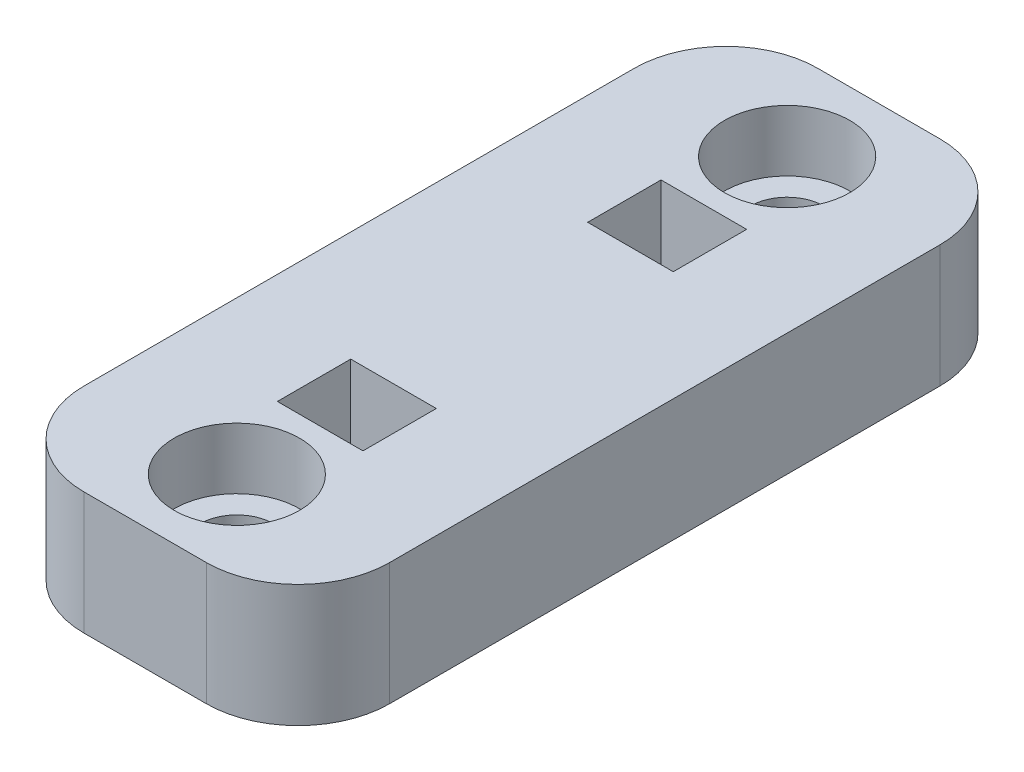
ISO-10303-21;
HEADER;
FILE_DESCRIPTION(('STEP AP214'),'2;1');
FILE_NAME('part.step','',(''),(''),'','','');
FILE_SCHEMA(('AUTOMOTIVE_DESIGN { 1 0 10303 214 1 1 1 1 }'));
ENDSEC;
DATA;
#1=APPLICATION_CONTEXT('core data for automotive mechanical design processes');
#2=APPLICATION_PROTOCOL_DEFINITION('international standard','automotive_design',2000,#1);
#3=PRODUCT_CONTEXT('',#1,'mechanical');
#4=PRODUCT('Part','Part','',(#3));
#5=PRODUCT_RELATED_PRODUCT_CATEGORY('part','',(#4));
#6=PRODUCT_DEFINITION_FORMATION('','',#4);
#7=PRODUCT_DEFINITION_CONTEXT('part definition',#1,'design');
#8=PRODUCT_DEFINITION('design','',#6,#7);
#9=PRODUCT_DEFINITION_SHAPE('','',#8);
#10=(LENGTH_UNIT() NAMED_UNIT(*) SI_UNIT(.MILLI.,.METRE.));
#11=(NAMED_UNIT(*) PLANE_ANGLE_UNIT() SI_UNIT($,.RADIAN.));
#12=(NAMED_UNIT(*) SI_UNIT($,.STERADIAN.) SOLID_ANGLE_UNIT());
#13=UNCERTAINTY_MEASURE_WITH_UNIT(LENGTH_MEASURE(1.E-05),#10,'distance_accuracy_value','');
#14=(GEOMETRIC_REPRESENTATION_CONTEXT(3) GLOBAL_UNCERTAINTY_ASSIGNED_CONTEXT((#13)) GLOBAL_UNIT_ASSIGNED_CONTEXT((#10,
#11,#12)) REPRESENTATION_CONTEXT('',''));
#15=CARTESIAN_POINT('',(0.,0.,0.));
#16=DIRECTION('',(0.,0.,1.));
#17=DIRECTION('',(1.,0.,0.));
#18=AXIS2_PLACEMENT_3D('',#15,#16,#17);
#19=CARTESIAN_POINT('',(5.,4.,-21.));
#20=DIRECTION('',(0.,-1.,0.));
#21=DIRECTION('',(0.,0.,-1.));
#22=AXIS2_PLACEMENT_3D('',#19,#20,#21);
#23=CYLINDRICAL_SURFACE('',#22,1.2);
#24=CARTESIAN_POINT('',(5.,0.,-21.));
#25=DIRECTION('',(0.,1.,0.));
#26=DIRECTION('',(0.,0.,1.));
#27=AXIS2_PLACEMENT_3D('',#24,#25,#26);
#28=CIRCLE('',#27,1.2);
#29=CARTESIAN_POINT('',(5.,0.,-19.8));
#30=VERTEX_POINT('',#29);
#31=EDGE_CURVE('E200',#30,#30,#28,.T.);
#32=ORIENTED_EDGE('',*,*,#31,.F.);
#33=EDGE_LOOP('',(#32));
#34=FACE_BOUND('',#33,.T.);
#35=CARTESIAN_POINT('',(5.,2.,-21.));
#36=DIRECTION('',(0.,1.,0.));
#37=DIRECTION('',(0.,0.,1.));
#38=AXIS2_PLACEMENT_3D('',#35,#36,#37);
#39=CIRCLE('',#38,1.2);
#40=CARTESIAN_POINT('',(5.,2.,-19.8));
#41=VERTEX_POINT('',#40);
#42=EDGE_CURVE('E47',#41,#41,#39,.T.);
#43=ORIENTED_EDGE('',*,*,#42,.T.);
#44=EDGE_LOOP('',(#43));
#45=FACE_BOUND('',#44,.T.);
#46=ADVANCED_FACE('F43',(#34,#45),#23,.F.);
#47=CARTESIAN_POINT('',(5.,4.,-3.));
#48=DIRECTION('',(0.,-1.,0.));
#49=DIRECTION('',(0.,0.,-1.));
#50=AXIS2_PLACEMENT_3D('',#47,#48,#49);
#51=CYLINDRICAL_SURFACE('',#50,1.2);
#52=CARTESIAN_POINT('',(5.,0.,-3.));
#53=DIRECTION('',(0.,1.,0.));
#54=DIRECTION('',(0.,0.,1.));
#55=AXIS2_PLACEMENT_3D('',#52,#53,#54);
#56=CIRCLE('',#55,1.2);
#57=CARTESIAN_POINT('',(5.,0.,-1.8));
#58=VERTEX_POINT('',#57);
#59=EDGE_CURVE('E342',#58,#58,#56,.T.);
#60=ORIENTED_EDGE('',*,*,#59,.F.);
#61=EDGE_LOOP('',(#60));
#62=FACE_BOUND('',#61,.T.);
#63=CARTESIAN_POINT('',(5.,2.,-3.));
#64=DIRECTION('',(0.,1.,0.));
#65=DIRECTION('',(0.,0.,1.));
#66=AXIS2_PLACEMENT_3D('',#63,#64,#65);
#67=CIRCLE('',#66,1.2);
#68=CARTESIAN_POINT('',(5.,2.,-1.8));
#69=VERTEX_POINT('',#68);
#70=EDGE_CURVE('E333',#69,#69,#67,.T.);
#71=ORIENTED_EDGE('',*,*,#70,.T.);
#72=EDGE_LOOP('',(#71));
#73=FACE_BOUND('',#72,.T.);
#74=ADVANCED_FACE('F371',(#62,#73),#51,.F.);
#75=CARTESIAN_POINT('',(0.,4.,0.));
#76=DIRECTION('',(0.,-1.,0.));
#77=DIRECTION('',(0.,0.,-1.));
#78=AXIS2_PLACEMENT_3D('',#75,#76,#77);
#79=PLANE('',#78);
#80=CARTESIAN_POINT('',(5.,4.,-3.));
#81=DIRECTION('',(0.,1.,0.));
#82=DIRECTION('',(0.,0.,1.));
#83=AXIS2_PLACEMENT_3D('',#80,#81,#82);
#84=CIRCLE('',#83,2.05);
#85=CARTESIAN_POINT('',(5.,4.,-0.950000000000001));
#86=VERTEX_POINT('',#85);
#87=EDGE_CURVE('E344',#86,#86,#84,.T.);
#88=ORIENTED_EDGE('',*,*,#87,.F.);
#89=EDGE_LOOP('',(#88));
#90=FACE_BOUND('',#89,.T.);
#91=CARTESIAN_POINT('',(5.,4.,-21.));
#92=DIRECTION('',(0.,1.,0.));
#93=DIRECTION('',(0.,0.,1.));
#94=AXIS2_PLACEMENT_3D('',#91,#92,#93);
#95=CIRCLE('',#94,2.05);
#96=CARTESIAN_POINT('',(5.,4.,-18.95));
#97=VERTEX_POINT('',#96);
#98=EDGE_CURVE('E350',#97,#97,#95,.T.);
#99=ORIENTED_EDGE('',*,*,#98,.F.);
#100=EDGE_LOOP('',(#99));
#101=FACE_BOUND('',#100,.T.);
#102=DIRECTION('',(0.,0.,1.));
#103=VECTOR('',#102,1.);
#104=CARTESIAN_POINT('',(3.6,4.,-18.275));
#105=LINE('',#104,#103);
#106=CARTESIAN_POINT('',(3.6,4.,-18.275));
#107=VERTEX_POINT('',#106);
#108=CARTESIAN_POINT('',(3.6,4.,-15.875));
#109=VERTEX_POINT('',#108);
#110=EDGE_CURVE('E217',#107,#109,#105,.T.);
#111=ORIENTED_EDGE('',*,*,#110,.F.);
#112=DIRECTION('',(-1.,0.,0.));
#113=VECTOR('',#112,1.);
#114=CARTESIAN_POINT('',(3.6,4.,-18.275));
#115=LINE('',#114,#113);
#116=CARTESIAN_POINT('',(6.4,4.,-18.275));
#117=VERTEX_POINT('',#116);
#118=EDGE_CURVE('E228',#117,#107,#115,.T.);
#119=ORIENTED_EDGE('',*,*,#118,.F.);
#120=DIRECTION('',(0.,0.,-1.));
#121=VECTOR('',#120,1.);
#122=CARTESIAN_POINT('',(6.4,4.,-18.275));
#123=LINE('',#122,#121);
#124=CARTESIAN_POINT('',(6.4,4.,-15.875));
#125=VERTEX_POINT('',#124);
#126=EDGE_CURVE('E224',#125,#117,#123,.T.);
#127=ORIENTED_EDGE('',*,*,#126,.F.);
#128=DIRECTION('',(1.,0.,0.));
#129=VECTOR('',#128,1.);
#130=CARTESIAN_POINT('',(3.6,4.,-15.875));
#131=LINE('',#130,#129);
#132=EDGE_CURVE('E220',#109,#125,#131,.T.);
#133=ORIENTED_EDGE('',*,*,#132,.F.);
#134=EDGE_LOOP('',(#111,#119,#127,#133));
#135=FACE_BOUND('',#134,.T.);
#136=DIRECTION('',(-1.,0.,0.));
#137=VECTOR('',#136,1.);
#138=CARTESIAN_POINT('',(0.,4.,-24.));
#139=LINE('',#138,#137);
#140=CARTESIAN_POINT('',(7.,4.,-24.));
#141=VERTEX_POINT('',#140);
#142=CARTESIAN_POINT('',(3.,4.,-24.));
#143=VERTEX_POINT('',#142);
#144=EDGE_CURVE('E271',#141,#143,#139,.T.);
#145=ORIENTED_EDGE('',*,*,#144,.T.);
#146=CARTESIAN_POINT('',(3.,4.,-21.));
#147=DIRECTION('',(0.,-1.,0.));
#148=DIRECTION('',(0.,0.,-1.));
#149=AXIS2_PLACEMENT_3D('',#146,#147,#148);
#150=CIRCLE('',#149,3.);
#151=CARTESIAN_POINT('',(0.,4.,-21.));
#152=VERTEX_POINT('',#151);
#153=EDGE_CURVE('E322',#143,#152,#150,.F.);
#154=ORIENTED_EDGE('',*,*,#153,.T.);
#155=DIRECTION('',(0.,0.,1.));
#156=VECTOR('',#155,1.);
#157=CARTESIAN_POINT('',(0.,4.,0.));
#158=LINE('',#157,#156);
#159=CARTESIAN_POINT('',(0.,4.,-3.));
#160=VERTEX_POINT('',#159);
#161=EDGE_CURVE('E260',#152,#160,#158,.T.);
#162=ORIENTED_EDGE('',*,*,#161,.T.);
#163=CARTESIAN_POINT('',(3.,4.,-3.));
#164=DIRECTION('',(0.,-1.,0.));
#165=DIRECTION('',(0.,0.,-1.));
#166=AXIS2_PLACEMENT_3D('',#163,#164,#165);
#167=CIRCLE('',#166,3.);
#168=CARTESIAN_POINT('',(3.,4.,0.));
#169=VERTEX_POINT('',#168);
#170=EDGE_CURVE('E314',#160,#169,#167,.F.);
#171=ORIENTED_EDGE('',*,*,#170,.T.);
#172=DIRECTION('',(1.,0.,0.));
#173=VECTOR('',#172,1.);
#174=CARTESIAN_POINT('',(0.,4.,0.));
#175=LINE('',#174,#173);
#176=CARTESIAN_POINT('',(7.,4.,0.));
#177=VERTEX_POINT('',#176);
#178=EDGE_CURVE('E264',#169,#177,#175,.T.);
#179=ORIENTED_EDGE('',*,*,#178,.T.);
#180=CARTESIAN_POINT('',(7.,4.,-3.));
#181=DIRECTION('',(0.,-1.,0.));
#182=DIRECTION('',(0.,0.,-1.));
#183=AXIS2_PLACEMENT_3D('',#180,#181,#182);
#184=CIRCLE('',#183,3.);
#185=CARTESIAN_POINT('',(10.,4.,-3.));
#186=VERTEX_POINT('',#185);
#187=EDGE_CURVE('E68',#177,#186,#184,.F.);
#188=ORIENTED_EDGE('',*,*,#187,.T.);
#189=DIRECTION('',(0.,0.,-1.));
#190=VECTOR('',#189,1.);
#191=CARTESIAN_POINT('',(10.,4.,0.));
#192=LINE('',#191,#190);
#193=CARTESIAN_POINT('',(10.,4.,-21.));
#194=VERTEX_POINT('',#193);
#195=EDGE_CURVE('E268',#186,#194,#192,.T.);
#196=ORIENTED_EDGE('',*,*,#195,.T.);
#197=CARTESIAN_POINT('',(7.,4.,-21.));
#198=DIRECTION('',(0.,-1.,0.));
#199=DIRECTION('',(0.,0.,-1.));
#200=AXIS2_PLACEMENT_3D('',#197,#198,#199);
#201=CIRCLE('',#200,3.);
#202=EDGE_CURVE('E319',#194,#141,#201,.F.);
#203=ORIENTED_EDGE('',*,*,#202,.T.);
#204=EDGE_LOOP('',(#145,#154,#162,#171,#179,#188,#196,#203));
#205=FACE_BOUND('',#204,.T.);
#206=DIRECTION('',(0.,0.,1.));
#207=VECTOR('',#206,1.);
#208=CARTESIAN_POINT('',(3.6,4.,-8.125));
#209=LINE('',#208,#207);
#210=CARTESIAN_POINT('',(3.6,4.,-8.125));
#211=VERTEX_POINT('',#210);
#212=CARTESIAN_POINT('',(3.6,4.,-5.725));
#213=VERTEX_POINT('',#212);
#214=EDGE_CURVE('E161',#211,#213,#209,.T.);
#215=ORIENTED_EDGE('',*,*,#214,.F.);
#216=DIRECTION('',(-1.,0.,0.));
#217=VECTOR('',#216,1.);
#218=CARTESIAN_POINT('',(3.6,4.,-8.125));
#219=LINE('',#218,#217);
#220=CARTESIAN_POINT('',(6.4,4.,-8.125));
#221=VERTEX_POINT('',#220);
#222=EDGE_CURVE('E191',#221,#211,#219,.T.);
#223=ORIENTED_EDGE('',*,*,#222,.F.);
#224=DIRECTION('',(0.,0.,-1.));
#225=VECTOR('',#224,1.);
#226=CARTESIAN_POINT('',(6.4,4.,-8.125));
#227=LINE('',#226,#225);
#228=CARTESIAN_POINT('',(6.4,4.,-5.725));
#229=VERTEX_POINT('',#228);
#230=EDGE_CURVE('E187',#229,#221,#227,.T.);
#231=ORIENTED_EDGE('',*,*,#230,.F.);
#232=DIRECTION('',(1.,0.,0.));
#233=VECTOR('',#232,1.);
#234=CARTESIAN_POINT('',(3.6,4.,-5.725));
#235=LINE('',#234,#233);
#236=EDGE_CURVE('E172',#213,#229,#235,.T.);
#237=ORIENTED_EDGE('',*,*,#236,.F.);
#238=EDGE_LOOP('',(#215,#223,#231,#237));
#239=FACE_BOUND('',#238,.T.);
#240=ADVANCED_FACE('F185',(#90,#101,#135,#205,#239),#79,.F.);
#241=CARTESIAN_POINT('',(0.,0.,0.));
#242=DIRECTION('',(0.,-1.,0.));
#243=DIRECTION('',(0.,0.,-1.));
#244=AXIS2_PLACEMENT_3D('',#241,#242,#243);
#245=PLANE('',#244);
#246=ORIENTED_EDGE('',*,*,#31,.T.);
#247=EDGE_LOOP('',(#246));
#248=FACE_BOUND('',#247,.T.);
#249=DIRECTION('',(0.,0.,1.));
#250=VECTOR('',#249,1.);
#251=CARTESIAN_POINT('',(0.,0.,0.));
#252=LINE('',#251,#250);
#253=CARTESIAN_POINT('',(0.,0.,-21.));
#254=VERTEX_POINT('',#253);
#255=CARTESIAN_POINT('',(0.,0.,-3.));
#256=VERTEX_POINT('',#255);
#257=EDGE_CURVE('E259',#254,#256,#252,.T.);
#258=ORIENTED_EDGE('',*,*,#257,.F.);
#259=CARTESIAN_POINT('',(3.,0.,-21.));
#260=DIRECTION('',(0.,-1.,0.));
#261=DIRECTION('',(0.,0.,-1.));
#262=AXIS2_PLACEMENT_3D('',#259,#260,#261);
#263=CIRCLE('',#262,3.);
#264=CARTESIAN_POINT('',(3.,0.,-24.));
#265=VERTEX_POINT('',#264);
#266=EDGE_CURVE('E304',#254,#265,#263,.T.);
#267=ORIENTED_EDGE('',*,*,#266,.T.);
#268=DIRECTION('',(-1.,0.,0.));
#269=VECTOR('',#268,1.);
#270=CARTESIAN_POINT('',(0.,0.,-24.));
#271=LINE('',#270,#269);
#272=CARTESIAN_POINT('',(7.,0.,-24.));
#273=VERTEX_POINT('',#272);
#274=EDGE_CURVE('E265',#273,#265,#271,.T.);
#275=ORIENTED_EDGE('',*,*,#274,.F.);
#276=CARTESIAN_POINT('',(7.,0.,-21.));
#277=DIRECTION('',(0.,-1.,0.));
#278=DIRECTION('',(0.,0.,-1.));
#279=AXIS2_PLACEMENT_3D('',#276,#277,#278);
#280=CIRCLE('',#279,3.);
#281=CARTESIAN_POINT('',(10.,0.,-21.));
#282=VERTEX_POINT('',#281);
#283=EDGE_CURVE('E301',#273,#282,#280,.T.);
#284=ORIENTED_EDGE('',*,*,#283,.T.);
#285=DIRECTION('',(0.,0.,-1.));
#286=VECTOR('',#285,1.);
#287=CARTESIAN_POINT('',(10.,0.,0.));
#288=LINE('',#287,#286);
#289=CARTESIAN_POINT('',(10.,0.,-3.));
#290=VERTEX_POINT('',#289);
#291=EDGE_CURVE('E283',#290,#282,#288,.T.);
#292=ORIENTED_EDGE('',*,*,#291,.F.);
#293=CARTESIAN_POINT('',(7.,0.,-3.));
#294=DIRECTION('',(0.,-1.,0.));
#295=DIRECTION('',(0.,0.,-1.));
#296=AXIS2_PLACEMENT_3D('',#293,#294,#295);
#297=CIRCLE('',#296,3.);
#298=CARTESIAN_POINT('',(7.,0.,0.));
#299=VERTEX_POINT('',#298);
#300=EDGE_CURVE('E298',#290,#299,#297,.T.);
#301=ORIENTED_EDGE('',*,*,#300,.T.);
#302=DIRECTION('',(1.,0.,0.));
#303=VECTOR('',#302,1.);
#304=CARTESIAN_POINT('',(0.,0.,0.));
#305=LINE('',#304,#303);
#306=CARTESIAN_POINT('',(3.,0.,0.));
#307=VERTEX_POINT('',#306);
#308=EDGE_CURVE('E279',#307,#299,#305,.T.);
#309=ORIENTED_EDGE('',*,*,#308,.F.);
#310=CARTESIAN_POINT('',(3.,0.,-3.));
#311=DIRECTION('',(0.,-1.,0.));
#312=DIRECTION('',(0.,0.,-1.));
#313=AXIS2_PLACEMENT_3D('',#310,#311,#312);
#314=CIRCLE('',#313,3.);
#315=EDGE_CURVE('E295',#307,#256,#314,.T.);
#316=ORIENTED_EDGE('',*,*,#315,.T.);
#317=EDGE_LOOP('',(#258,#267,#275,#284,#292,#301,#309,#316));
#318=FACE_BOUND('',#317,.T.);
#319=DIRECTION('',(-1.,0.,0.));
#320=VECTOR('',#319,1.);
#321=CARTESIAN_POINT('',(3.6,0.,-18.275));
#322=LINE('',#321,#320);
#323=CARTESIAN_POINT('',(6.4,0.,-18.275));
#324=VERTEX_POINT('',#323);
#325=CARTESIAN_POINT('',(3.6,0.,-18.275));
#326=VERTEX_POINT('',#325);
#327=EDGE_CURVE('E221',#324,#326,#322,.T.);
#328=ORIENTED_EDGE('',*,*,#327,.T.);
#329=DIRECTION('',(0.,0.,1.));
#330=VECTOR('',#329,1.);
#331=CARTESIAN_POINT('',(3.6,0.,-18.275));
#332=LINE('',#331,#330);
#333=CARTESIAN_POINT('',(3.6,0.,-15.875));
#334=VERTEX_POINT('',#333);
#335=EDGE_CURVE('E181',#326,#334,#332,.T.);
#336=ORIENTED_EDGE('',*,*,#335,.T.);
#337=DIRECTION('',(1.,0.,0.));
#338=VECTOR('',#337,1.);
#339=CARTESIAN_POINT('',(3.6,0.,-15.875));
#340=LINE('',#339,#338);
#341=CARTESIAN_POINT('',(6.4,0.,-15.875));
#342=VERTEX_POINT('',#341);
#343=EDGE_CURVE('E235',#334,#342,#340,.T.);
#344=ORIENTED_EDGE('',*,*,#343,.T.);
#345=DIRECTION('',(0.,0.,-1.));
#346=VECTOR('',#345,1.);
#347=CARTESIAN_POINT('',(6.4,0.,-18.275));
#348=LINE('',#347,#346);
#349=EDGE_CURVE('E239',#342,#324,#348,.T.);
#350=ORIENTED_EDGE('',*,*,#349,.T.);
#351=EDGE_LOOP('',(#328,#336,#344,#350));
#352=FACE_BOUND('',#351,.T.);
#353=DIRECTION('',(-1.,0.,0.));
#354=VECTOR('',#353,1.);
#355=CARTESIAN_POINT('',(3.6,0.,-8.125));
#356=LINE('',#355,#354);
#357=CARTESIAN_POINT('',(6.4,0.,-8.125));
#358=VERTEX_POINT('',#357);
#359=CARTESIAN_POINT('',(3.6,0.,-8.125));
#360=VERTEX_POINT('',#359);
#361=EDGE_CURVE('E173',#358,#360,#356,.T.);
#362=ORIENTED_EDGE('',*,*,#361,.T.);
#363=DIRECTION('',(0.,0.,1.));
#364=VECTOR('',#363,1.);
#365=CARTESIAN_POINT('',(3.6,0.,-8.125));
#366=LINE('',#365,#364);
#367=CARTESIAN_POINT('',(3.6,0.,-5.725));
#368=VERTEX_POINT('',#367);
#369=EDGE_CURVE('E197',#360,#368,#366,.T.);
#370=ORIENTED_EDGE('',*,*,#369,.T.);
#371=DIRECTION('',(1.,0.,0.));
#372=VECTOR('',#371,1.);
#373=CARTESIAN_POINT('',(3.6,0.,-5.725));
#374=LINE('',#373,#372);
#375=CARTESIAN_POINT('',(6.4,0.,-5.725));
#376=VERTEX_POINT('',#375);
#377=EDGE_CURVE('E179',#368,#376,#374,.T.);
#378=ORIENTED_EDGE('',*,*,#377,.T.);
#379=DIRECTION('',(0.,0.,-1.));
#380=VECTOR('',#379,1.);
#381=CARTESIAN_POINT('',(6.4,0.,-8.125));
#382=LINE('',#381,#380);
#383=EDGE_CURVE('E203',#376,#358,#382,.T.);
#384=ORIENTED_EDGE('',*,*,#383,.T.);
#385=EDGE_LOOP('',(#362,#370,#378,#384));
#386=FACE_BOUND('',#385,.T.);
#387=ORIENTED_EDGE('',*,*,#59,.T.);
#388=EDGE_LOOP('',(#387));
#389=FACE_BOUND('',#388,.T.);
#390=ADVANCED_FACE('F366',(#248,#318,#352,#386,#389),#245,.T.);
#391=CARTESIAN_POINT('',(0.,4.,0.));
#392=DIRECTION('',(1.,0.,0.));
#393=DIRECTION('',(0.,0.,-1.));
#394=AXIS2_PLACEMENT_3D('',#391,#392,#393);
#395=PLANE('',#394);
#396=ORIENTED_EDGE('',*,*,#161,.F.);
#397=DIRECTION('',(0.,-1.,0.));
#398=VECTOR('',#397,1.);
#399=CARTESIAN_POINT('',(0.,4.,-21.));
#400=LINE('',#399,#398);
#401=EDGE_CURVE('E291',#152,#254,#400,.T.);
#402=ORIENTED_EDGE('',*,*,#401,.T.);
#403=ORIENTED_EDGE('',*,*,#257,.T.);
#404=DIRECTION('',(0.,-1.,0.));
#405=VECTOR('',#404,1.);
#406=CARTESIAN_POINT('',(0.,4.,-3.));
#407=LINE('',#406,#405);
#408=EDGE_CURVE('E275',#256,#160,#407,.F.);
#409=ORIENTED_EDGE('',*,*,#408,.T.);
#410=EDGE_LOOP('',(#396,#402,#403,#409));
#411=FACE_BOUND('',#410,.T.);
#412=ADVANCED_FACE('F407',(#411),#395,.F.);
#413=CARTESIAN_POINT('',(0.,4.,0.));
#414=DIRECTION('',(0.,0.,-1.));
#415=DIRECTION('',(-1.,0.,0.));
#416=AXIS2_PLACEMENT_3D('',#413,#414,#415);
#417=PLANE('',#416);
#418=ORIENTED_EDGE('',*,*,#308,.T.);
#419=DIRECTION('',(0.,-1.,0.));
#420=VECTOR('',#419,1.);
#421=CARTESIAN_POINT('',(7.,4.,0.));
#422=LINE('',#421,#420);
#423=EDGE_CURVE('E11',#299,#177,#422,.F.);
#424=ORIENTED_EDGE('',*,*,#423,.T.);
#425=ORIENTED_EDGE('',*,*,#178,.F.);
#426=DIRECTION('',(0.,-1.,0.));
#427=VECTOR('',#426,1.);
#428=CARTESIAN_POINT('',(3.,4.,0.));
#429=LINE('',#428,#427);
#430=EDGE_CURVE('E53',#169,#307,#429,.T.);
#431=ORIENTED_EDGE('',*,*,#430,.T.);
#432=EDGE_LOOP('',(#418,#424,#425,#431));
#433=FACE_BOUND('',#432,.T.);
#434=ADVANCED_FACE('F417',(#433),#417,.F.);
#435=CARTESIAN_POINT('',(10.,4.,0.));
#436=DIRECTION('',(-1.,0.,0.));
#437=DIRECTION('',(0.,0.,1.));
#438=AXIS2_PLACEMENT_3D('',#435,#436,#437);
#439=PLANE('',#438);
#440=ORIENTED_EDGE('',*,*,#291,.T.);
#441=DIRECTION('',(0.,-1.,0.));
#442=VECTOR('',#441,1.);
#443=CARTESIAN_POINT('',(10.,4.,-21.));
#444=LINE('',#443,#442);
#445=EDGE_CURVE('E61',#282,#194,#444,.F.);
#446=ORIENTED_EDGE('',*,*,#445,.T.);
#447=ORIENTED_EDGE('',*,*,#195,.F.);
#448=DIRECTION('',(0.,-1.,0.));
#449=VECTOR('',#448,1.);
#450=CARTESIAN_POINT('',(10.,4.,-3.));
#451=LINE('',#450,#449);
#452=EDGE_CURVE('E325',#186,#290,#451,.T.);
#453=ORIENTED_EDGE('',*,*,#452,.T.);
#454=EDGE_LOOP('',(#440,#446,#447,#453));
#455=FACE_BOUND('',#454,.T.);
#456=ADVANCED_FACE('F423',(#455),#439,.F.);
#457=CARTESIAN_POINT('',(0.,4.,-24.));
#458=DIRECTION('',(0.,0.,1.));
#459=DIRECTION('',(1.,0.,0.));
#460=AXIS2_PLACEMENT_3D('',#457,#458,#459);
#461=PLANE('',#460);
#462=ORIENTED_EDGE('',*,*,#274,.T.);
#463=DIRECTION('',(0.,-1.,0.));
#464=VECTOR('',#463,1.);
#465=CARTESIAN_POINT('',(3.,4.,-24.));
#466=LINE('',#465,#464);
#467=EDGE_CURVE('E311',#265,#143,#466,.F.);
#468=ORIENTED_EDGE('',*,*,#467,.T.);
#469=ORIENTED_EDGE('',*,*,#144,.F.);
#470=DIRECTION('',(0.,-1.,0.));
#471=VECTOR('',#470,1.);
#472=CARTESIAN_POINT('',(7.,4.,-24.));
#473=LINE('',#472,#471);
#474=EDGE_CURVE('E307',#141,#273,#473,.T.);
#475=ORIENTED_EDGE('',*,*,#474,.T.);
#476=EDGE_LOOP('',(#462,#468,#469,#475));
#477=FACE_BOUND('',#476,.T.);
#478=ADVANCED_FACE('F426',(#477),#461,.F.);
#479=CARTESIAN_POINT('',(3.6,4.,-18.275));
#480=DIRECTION('',(1.,0.,0.));
#481=DIRECTION('',(0.,0.,-1.));
#482=AXIS2_PLACEMENT_3D('',#479,#480,#481);
#483=PLANE('',#482);
#484=ORIENTED_EDGE('',*,*,#335,.F.);
#485=DIRECTION('',(0.,-1.,0.));
#486=VECTOR('',#485,1.);
#487=CARTESIAN_POINT('',(3.6,4.,-18.275));
#488=LINE('',#487,#486);
#489=EDGE_CURVE('E231',#107,#326,#488,.T.);
#490=ORIENTED_EDGE('',*,*,#489,.F.);
#491=ORIENTED_EDGE('',*,*,#110,.T.);
#492=DIRECTION('',(0.,-1.,0.));
#493=VECTOR('',#492,1.);
#494=CARTESIAN_POINT('',(3.6,4.,-15.875));
#495=LINE('',#494,#493);
#496=EDGE_CURVE('E255',#109,#334,#495,.T.);
#497=ORIENTED_EDGE('',*,*,#496,.T.);
#498=EDGE_LOOP('',(#484,#490,#491,#497));
#499=FACE_BOUND('',#498,.T.);
#500=ADVANCED_FACE('F428',(#499),#483,.T.);
#501=CARTESIAN_POINT('',(3.6,4.,-15.875));
#502=DIRECTION('',(0.,0.,-1.));
#503=DIRECTION('',(-1.,0.,0.));
#504=AXIS2_PLACEMENT_3D('',#501,#502,#503);
#505=PLANE('',#504);
#506=ORIENTED_EDGE('',*,*,#343,.F.);
#507=ORIENTED_EDGE('',*,*,#496,.F.);
#508=ORIENTED_EDGE('',*,*,#132,.T.);
#509=DIRECTION('',(0.,-1.,0.));
#510=VECTOR('',#509,1.);
#511=CARTESIAN_POINT('',(6.4,4.,-15.875));
#512=LINE('',#511,#510);
#513=EDGE_CURVE('E252',#125,#342,#512,.T.);
#514=ORIENTED_EDGE('',*,*,#513,.T.);
#515=EDGE_LOOP('',(#506,#507,#508,#514));
#516=FACE_BOUND('',#515,.T.);
#517=ADVANCED_FACE('F434',(#516),#505,.T.);
#518=CARTESIAN_POINT('',(6.4,4.,-18.275));
#519=DIRECTION('',(-1.,0.,0.));
#520=DIRECTION('',(0.,0.,1.));
#521=AXIS2_PLACEMENT_3D('',#518,#519,#520);
#522=PLANE('',#521);
#523=ORIENTED_EDGE('',*,*,#349,.F.);
#524=ORIENTED_EDGE('',*,*,#513,.F.);
#525=ORIENTED_EDGE('',*,*,#126,.T.);
#526=DIRECTION('',(0.,-1.,0.));
#527=VECTOR('',#526,1.);
#528=CARTESIAN_POINT('',(6.4,4.,-18.275));
#529=LINE('',#528,#527);
#530=EDGE_CURVE('E249',#117,#324,#529,.T.);
#531=ORIENTED_EDGE('',*,*,#530,.T.);
#532=EDGE_LOOP('',(#523,#524,#525,#531));
#533=FACE_BOUND('',#532,.T.);
#534=ADVANCED_FACE('F482',(#533),#522,.T.);
#535=CARTESIAN_POINT('',(3.6,4.,-18.275));
#536=DIRECTION('',(0.,0.,1.));
#537=DIRECTION('',(1.,0.,0.));
#538=AXIS2_PLACEMENT_3D('',#535,#536,#537);
#539=PLANE('',#538);
#540=ORIENTED_EDGE('',*,*,#327,.F.);
#541=ORIENTED_EDGE('',*,*,#530,.F.);
#542=ORIENTED_EDGE('',*,*,#118,.T.);
#543=ORIENTED_EDGE('',*,*,#489,.T.);
#544=EDGE_LOOP('',(#540,#541,#542,#543));
#545=FACE_BOUND('',#544,.T.);
#546=ADVANCED_FACE('F479',(#545),#539,.T.);
#547=CARTESIAN_POINT('',(3.6,4.,-8.125));
#548=DIRECTION('',(1.,0.,0.));
#549=DIRECTION('',(0.,0.,-1.));
#550=AXIS2_PLACEMENT_3D('',#547,#548,#549);
#551=PLANE('',#550);
#552=ORIENTED_EDGE('',*,*,#369,.F.);
#553=DIRECTION('',(0.,-1.,0.));
#554=VECTOR('',#553,1.);
#555=CARTESIAN_POINT('',(3.6,4.,-8.125));
#556=LINE('',#555,#554);
#557=EDGE_CURVE('E167',#211,#360,#556,.T.);
#558=ORIENTED_EDGE('',*,*,#557,.F.);
#559=ORIENTED_EDGE('',*,*,#214,.T.);
#560=DIRECTION('',(0.,-1.,0.));
#561=VECTOR('',#560,1.);
#562=CARTESIAN_POINT('',(3.6,4.,-5.725));
#563=LINE('',#562,#561);
#564=EDGE_CURVE('E164',#213,#368,#563,.T.);
#565=ORIENTED_EDGE('',*,*,#564,.T.);
#566=EDGE_LOOP('',(#552,#558,#559,#565));
#567=FACE_BOUND('',#566,.T.);
#568=ADVANCED_FACE('F163',(#567),#551,.T.);
#569=CARTESIAN_POINT('',(3.6,4.,-5.725));
#570=DIRECTION('',(0.,0.,-1.));
#571=DIRECTION('',(-1.,0.,0.));
#572=AXIS2_PLACEMENT_3D('',#569,#570,#571);
#573=PLANE('',#572);
#574=ORIENTED_EDGE('',*,*,#377,.F.);
#575=ORIENTED_EDGE('',*,*,#564,.F.);
#576=ORIENTED_EDGE('',*,*,#236,.T.);
#577=DIRECTION('',(0.,-1.,0.));
#578=VECTOR('',#577,1.);
#579=CARTESIAN_POINT('',(6.4,4.,-5.725));
#580=LINE('',#579,#578);
#581=EDGE_CURVE('E182',#229,#376,#580,.T.);
#582=ORIENTED_EDGE('',*,*,#581,.T.);
#583=EDGE_LOOP('',(#574,#575,#576,#582));
#584=FACE_BOUND('',#583,.T.);
#585=ADVANCED_FACE('F176',(#584),#573,.T.);
#586=CARTESIAN_POINT('',(6.4,4.,-8.125));
#587=DIRECTION('',(-1.,0.,0.));
#588=DIRECTION('',(0.,0.,1.));
#589=AXIS2_PLACEMENT_3D('',#586,#587,#588);
#590=PLANE('',#589);
#591=ORIENTED_EDGE('',*,*,#383,.F.);
#592=ORIENTED_EDGE('',*,*,#581,.F.);
#593=ORIENTED_EDGE('',*,*,#230,.T.);
#594=DIRECTION('',(0.,-1.,0.));
#595=VECTOR('',#594,1.);
#596=CARTESIAN_POINT('',(6.4,4.,-8.125));
#597=LINE('',#596,#595);
#598=EDGE_CURVE('E212',#221,#358,#597,.T.);
#599=ORIENTED_EDGE('',*,*,#598,.T.);
#600=EDGE_LOOP('',(#591,#592,#593,#599));
#601=FACE_BOUND('',#600,.T.);
#602=ADVANCED_FACE('F470',(#601),#590,.T.);
#603=CARTESIAN_POINT('',(3.6,4.,-8.125));
#604=DIRECTION('',(0.,0.,1.));
#605=DIRECTION('',(1.,0.,0.));
#606=AXIS2_PLACEMENT_3D('',#603,#604,#605);
#607=PLANE('',#606);
#608=ORIENTED_EDGE('',*,*,#361,.F.);
#609=ORIENTED_EDGE('',*,*,#598,.F.);
#610=ORIENTED_EDGE('',*,*,#222,.T.);
#611=ORIENTED_EDGE('',*,*,#557,.T.);
#612=EDGE_LOOP('',(#608,#609,#610,#611));
#613=FACE_BOUND('',#612,.T.);
#614=ADVANCED_FACE('F446',(#613),#607,.T.);
#615=CARTESIAN_POINT('',(3.,4.,-21.));
#616=DIRECTION('',(0.,-1.,0.));
#617=DIRECTION('',(0.,0.,-1.));
#618=AXIS2_PLACEMENT_3D('',#615,#616,#617);
#619=CYLINDRICAL_SURFACE('',#618,3.);
#620=ORIENTED_EDGE('',*,*,#153,.F.);
#621=ORIENTED_EDGE('',*,*,#467,.F.);
#622=ORIENTED_EDGE('',*,*,#266,.F.);
#623=ORIENTED_EDGE('',*,*,#401,.F.);
#624=EDGE_LOOP('',(#620,#621,#622,#623));
#625=FACE_BOUND('',#624,.T.);
#626=ADVANCED_FACE('F404',(#625),#619,.T.);
#627=CARTESIAN_POINT('',(7.,4.,-21.));
#628=DIRECTION('',(0.,-1.,0.));
#629=DIRECTION('',(0.,0.,-1.));
#630=AXIS2_PLACEMENT_3D('',#627,#628,#629);
#631=CYLINDRICAL_SURFACE('',#630,3.);
#632=ORIENTED_EDGE('',*,*,#202,.F.);
#633=ORIENTED_EDGE('',*,*,#445,.F.);
#634=ORIENTED_EDGE('',*,*,#283,.F.);
#635=ORIENTED_EDGE('',*,*,#474,.F.);
#636=EDGE_LOOP('',(#632,#633,#634,#635));
#637=FACE_BOUND('',#636,.T.);
#638=ADVANCED_FACE('F425',(#637),#631,.T.);
#639=CARTESIAN_POINT('',(7.,4.,-3.));
#640=DIRECTION('',(0.,-1.,0.));
#641=DIRECTION('',(0.,0.,-1.));
#642=AXIS2_PLACEMENT_3D('',#639,#640,#641);
#643=CYLINDRICAL_SURFACE('',#642,3.);
#644=ORIENTED_EDGE('',*,*,#187,.F.);
#645=ORIENTED_EDGE('',*,*,#423,.F.);
#646=ORIENTED_EDGE('',*,*,#300,.F.);
#647=ORIENTED_EDGE('',*,*,#452,.F.);
#648=EDGE_LOOP('',(#644,#645,#646,#647));
#649=FACE_BOUND('',#648,.T.);
#650=ADVANCED_FACE('F421',(#649),#643,.T.);
#651=CARTESIAN_POINT('',(3.,4.,-3.));
#652=DIRECTION('',(0.,-1.,0.));
#653=DIRECTION('',(0.,0.,-1.));
#654=AXIS2_PLACEMENT_3D('',#651,#652,#653);
#655=CYLINDRICAL_SURFACE('',#654,3.);
#656=ORIENTED_EDGE('',*,*,#170,.F.);
#657=ORIENTED_EDGE('',*,*,#408,.F.);
#658=ORIENTED_EDGE('',*,*,#315,.F.);
#659=ORIENTED_EDGE('',*,*,#430,.F.);
#660=EDGE_LOOP('',(#656,#657,#658,#659));
#661=FACE_BOUND('',#660,.T.);
#662=ADVANCED_FACE('F45',(#661),#655,.T.);
#663=CARTESIAN_POINT('',(5.,2.,-3.));
#664=DIRECTION('',(0.,1.,0.));
#665=DIRECTION('',(0.,0.,1.));
#666=AXIS2_PLACEMENT_3D('',#663,#664,#665);
#667=CYLINDRICAL_SURFACE('',#666,2.05);
#668=CARTESIAN_POINT('',(5.,2.,-3.));
#669=DIRECTION('',(0.,1.,0.));
#670=DIRECTION('',(0.,0.,1.));
#671=AXIS2_PLACEMENT_3D('',#668,#669,#670);
#672=CIRCLE('',#671,2.05);
#673=CARTESIAN_POINT('',(5.,2.,-0.950000000000001));
#674=VERTEX_POINT('',#673);
#675=EDGE_CURVE('E336',#674,#674,#672,.T.);
#676=ORIENTED_EDGE('',*,*,#675,.F.);
#677=EDGE_LOOP('',(#676));
#678=FACE_BOUND('',#677,.T.);
#679=ORIENTED_EDGE('',*,*,#87,.T.);
#680=EDGE_LOOP('',(#679));
#681=FACE_BOUND('',#680,.T.);
#682=ADVANCED_FACE('F452',(#678,#681),#667,.F.);
#683=CARTESIAN_POINT('',(5.,2.,-3.));
#684=DIRECTION('',(0.,1.,0.));
#685=DIRECTION('',(0.,0.,1.));
#686=AXIS2_PLACEMENT_3D('',#683,#684,#685);
#687=PLANE('',#686);
#688=ORIENTED_EDGE('',*,*,#70,.F.);
#689=EDGE_LOOP('',(#688));
#690=FACE_BOUND('',#689,.T.);
#691=ORIENTED_EDGE('',*,*,#675,.T.);
#692=EDGE_LOOP('',(#691));
#693=FACE_BOUND('',#692,.T.);
#694=ADVANCED_FACE('F384',(#690,#693),#687,.T.);
#695=CARTESIAN_POINT('',(5.,2.,-21.));
#696=DIRECTION('',(0.,1.,0.));
#697=DIRECTION('',(0.,0.,1.));
#698=AXIS2_PLACEMENT_3D('',#695,#696,#697);
#699=CYLINDRICAL_SURFACE('',#698,2.05);
#700=CARTESIAN_POINT('',(5.,2.,-21.));
#701=DIRECTION('',(0.,1.,0.));
#702=DIRECTION('',(0.,0.,1.));
#703=AXIS2_PLACEMENT_3D('',#700,#701,#702);
#704=CIRCLE('',#703,2.05);
#705=CARTESIAN_POINT('',(5.,2.,-18.95));
#706=VERTEX_POINT('',#705);
#707=EDGE_CURVE('E356',#706,#706,#704,.T.);
#708=ORIENTED_EDGE('',*,*,#707,.F.);
#709=EDGE_LOOP('',(#708));
#710=FACE_BOUND('',#709,.T.);
#711=ORIENTED_EDGE('',*,*,#98,.T.);
#712=EDGE_LOOP('',(#711));
#713=FACE_BOUND('',#712,.T.);
#714=ADVANCED_FACE('F378',(#710,#713),#699,.F.);
#715=CARTESIAN_POINT('',(5.,2.,-21.));
#716=DIRECTION('',(0.,1.,0.));
#717=DIRECTION('',(0.,0.,1.));
#718=AXIS2_PLACEMENT_3D('',#715,#716,#717);
#719=PLANE('',#718);
#720=ORIENTED_EDGE('',*,*,#42,.F.);
#721=EDGE_LOOP('',(#720));
#722=FACE_BOUND('',#721,.T.);
#723=ORIENTED_EDGE('',*,*,#707,.T.);
#724=EDGE_LOOP('',(#723));
#725=FACE_BOUND('',#724,.T.);
#726=ADVANCED_FACE('F375',(#722,#725),#719,.T.);
#727=CLOSED_SHELL('',(#46,#74,#240,#390,#412,#434,#456,#478,#500,#517,#534,#546,#568,#585,#602,
#614,#626,#638,#650,#662,#682,#694,#714,#726));
#728=MANIFOLD_SOLID_BREP('B2',#727);
#729=ADVANCED_BREP_SHAPE_REPRESENTATION('',(#18,#728),#14);
#730=SHAPE_DEFINITION_REPRESENTATION(#9,#729);
ENDSEC;
END-ISO-10303-21;
